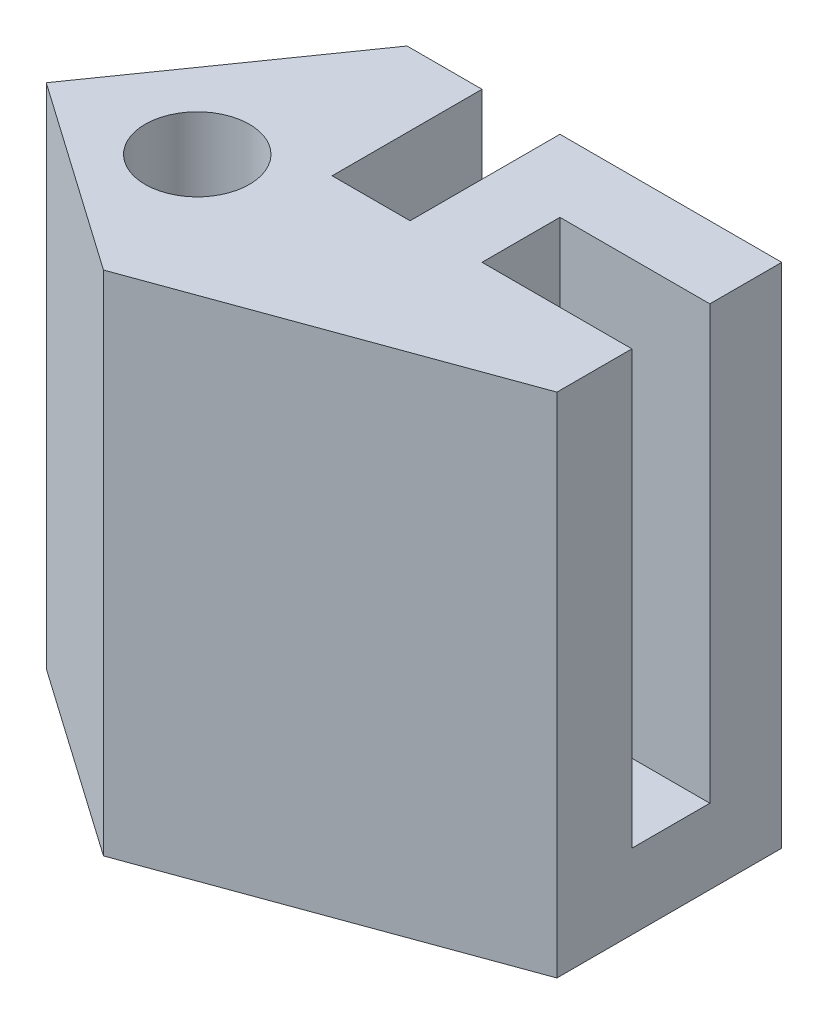
ISO-10303-21;
HEADER;
FILE_DESCRIPTION(('STEP AP214'),'2;1');
FILE_NAME('part.step','',(''),(''),'','','');
FILE_SCHEMA(('AUTOMOTIVE_DESIGN { 1 0 10303 214 1 1 1 1 }'));
ENDSEC;
DATA;
#1=APPLICATION_CONTEXT('core data for automotive mechanical design processes');
#2=APPLICATION_PROTOCOL_DEFINITION('international standard','automotive_design',2000,#1);
#3=PRODUCT_CONTEXT('',#1,'mechanical');
#4=PRODUCT('Part','Part','',(#3));
#5=PRODUCT_RELATED_PRODUCT_CATEGORY('part','',(#4));
#6=PRODUCT_DEFINITION_FORMATION('','',#4);
#7=PRODUCT_DEFINITION_CONTEXT('part definition',#1,'design');
#8=PRODUCT_DEFINITION('design','',#6,#7);
#9=PRODUCT_DEFINITION_SHAPE('','',#8);
#10=(LENGTH_UNIT() NAMED_UNIT(*) SI_UNIT(.MILLI.,.METRE.));
#11=(NAMED_UNIT(*) PLANE_ANGLE_UNIT() SI_UNIT($,.RADIAN.));
#12=(NAMED_UNIT(*) SI_UNIT($,.STERADIAN.) SOLID_ANGLE_UNIT());
#13=UNCERTAINTY_MEASURE_WITH_UNIT(LENGTH_MEASURE(1.E-05),#10,'distance_accuracy_value','');
#14=(GEOMETRIC_REPRESENTATION_CONTEXT(3) GLOBAL_UNCERTAINTY_ASSIGNED_CONTEXT((#13)) GLOBAL_UNIT_ASSIGNED_CONTEXT((#10,
#11,#12)) REPRESENTATION_CONTEXT('',''));
#15=CARTESIAN_POINT('',(0.,0.,0.));
#16=DIRECTION('',(0.,0.,1.));
#17=DIRECTION('',(1.,0.,0.));
#18=AXIS2_PLACEMENT_3D('',#15,#16,#17);
#19=CARTESIAN_POINT('',(12.954,36.650000106,-19.05));
#20=DIRECTION('',(1.,0.,0.));
#21=DIRECTION('',(0.,0.,-1.));
#22=AXIS2_PLACEMENT_3D('',#19,#20,#21);
#23=PLANE('',#22);
#24=DIRECTION('',(0.,0.,1.));
#25=VECTOR('',#24,1.);
#26=CARTESIAN_POINT('',(12.954,0.,-19.05));
#27=LINE('',#26,#25);
#28=CARTESIAN_POINT('',(12.954,0.,-19.05));
#29=VERTEX_POINT('',#28);
#30=CARTESIAN_POINT('',(12.954,0.,-6.35000000000003));
#31=VERTEX_POINT('',#30);
#32=EDGE_CURVE('E167',#29,#31,#27,.T.);
#33=ORIENTED_EDGE('',*,*,#32,.T.);
#34=DIRECTION('',(0.,-1.,0.));
#35=VECTOR('',#34,1.);
#36=CARTESIAN_POINT('',(12.954,36.650000106,-6.35000000000003));
#37=LINE('',#36,#35);
#38=CARTESIAN_POINT('',(12.954,36.650000106,-6.35000000000003));
#39=VERTEX_POINT('',#38);
#40=EDGE_CURVE('E235',#39,#31,#37,.T.);
#41=ORIENTED_EDGE('',*,*,#40,.F.);
#42=DIRECTION('',(0.,0.,1.));
#43=VECTOR('',#42,1.);
#44=CARTESIAN_POINT('',(12.954,36.650000106,-19.05));
#45=LINE('',#44,#43);
#46=CARTESIAN_POINT('',(12.954,36.650000106,-19.05));
#47=VERTEX_POINT('',#46);
#48=EDGE_CURVE('E174',#47,#39,#45,.T.);
#49=ORIENTED_EDGE('',*,*,#48,.F.);
#50=DIRECTION('',(0.,-1.,0.));
#51=VECTOR('',#50,1.);
#52=CARTESIAN_POINT('',(12.954,36.650000106,-19.05));
#53=LINE('',#52,#51);
#54=EDGE_CURVE('E47',#47,#29,#53,.T.);
#55=ORIENTED_EDGE('',*,*,#54,.T.);
#56=EDGE_LOOP('',(#33,#41,#49,#55));
#57=FACE_BOUND('',#56,.T.);
#58=ADVANCED_FACE('F39',(#57),#23,.F.);
#59=CARTESIAN_POINT('',(6.35000000000001,36.650000106,-6.35000000000003));
#60=DIRECTION('',(0.,0.,1.));
#61=DIRECTION('',(1.,0.,0.));
#62=AXIS2_PLACEMENT_3D('',#59,#60,#61);
#63=PLANE('',#62);
#64=DIRECTION('',(-1.,0.,0.));
#65=VECTOR('',#64,1.);
#66=CARTESIAN_POINT('',(6.35000000000001,0.,-6.35000000000003));
#67=LINE('',#66,#65);
#68=CARTESIAN_POINT('',(6.35000000000001,0.,-6.35000000000003));
#69=VERTEX_POINT('',#68);
#70=EDGE_CURVE('E198',#31,#69,#67,.T.);
#71=ORIENTED_EDGE('',*,*,#70,.T.);
#72=DIRECTION('',(0.,-1.,0.));
#73=VECTOR('',#72,1.);
#74=CARTESIAN_POINT('',(6.35000000000001,36.650000106,-6.35000000000003));
#75=LINE('',#74,#73);
#76=CARTESIAN_POINT('',(6.35000000000001,36.650000106,-6.35000000000003));
#77=VERTEX_POINT('',#76);
#78=EDGE_CURVE('E232',#77,#69,#75,.T.);
#79=ORIENTED_EDGE('',*,*,#78,.F.);
#80=DIRECTION('',(-1.,0.,0.));
#81=VECTOR('',#80,1.);
#82=CARTESIAN_POINT('',(6.35000000000001,36.650000106,-6.35000000000003));
#83=LINE('',#82,#81);
#84=EDGE_CURVE('E176',#39,#77,#83,.T.);
#85=ORIENTED_EDGE('',*,*,#84,.F.);
#86=ORIENTED_EDGE('',*,*,#40,.T.);
#87=EDGE_LOOP('',(#71,#79,#85,#86));
#88=FACE_BOUND('',#87,.T.);
#89=ADVANCED_FACE('F252',(#88),#63,.F.);
#90=CARTESIAN_POINT('',(6.35000000000001,36.650000106,-19.05));
#91=DIRECTION('',(-1.,0.,0.));
#92=DIRECTION('',(0.,0.,1.));
#93=AXIS2_PLACEMENT_3D('',#90,#91,#92);
#94=PLANE('',#93);
#95=DIRECTION('',(0.,0.,-1.));
#96=VECTOR('',#95,1.);
#97=CARTESIAN_POINT('',(6.35000000000001,0.,-19.05));
#98=LINE('',#97,#96);
#99=CARTESIAN_POINT('',(6.35000000000001,0.,-19.05));
#100=VERTEX_POINT('',#99);
#101=EDGE_CURVE('E201',#69,#100,#98,.T.);
#102=ORIENTED_EDGE('',*,*,#101,.T.);
#103=DIRECTION('',(0.,-1.,0.));
#104=VECTOR('',#103,1.);
#105=CARTESIAN_POINT('',(6.35000000000001,36.650000106,-19.05));
#106=LINE('',#105,#104);
#107=CARTESIAN_POINT('',(6.35000000000001,36.650000106,-19.05));
#108=VERTEX_POINT('',#107);
#109=EDGE_CURVE('E230',#108,#100,#106,.T.);
#110=ORIENTED_EDGE('',*,*,#109,.F.);
#111=DIRECTION('',(0.,0.,-1.));
#112=VECTOR('',#111,1.);
#113=CARTESIAN_POINT('',(6.35000000000001,36.650000106,-19.05));
#114=LINE('',#113,#112);
#115=EDGE_CURVE('E178',#77,#108,#114,.T.);
#116=ORIENTED_EDGE('',*,*,#115,.F.);
#117=ORIENTED_EDGE('',*,*,#78,.T.);
#118=EDGE_LOOP('',(#102,#110,#116,#117));
#119=FACE_BOUND('',#118,.T.);
#120=ADVANCED_FACE('F247',(#119),#94,.F.);
#121=CARTESIAN_POINT('',(0.,36.650000106,-19.05));
#122=DIRECTION('',(0.,0.,1.));
#123=DIRECTION('',(1.,0.,0.));
#124=AXIS2_PLACEMENT_3D('',#121,#122,#123);
#125=PLANE('',#124);
#126=ORIENTED_EDGE('',*,*,#109,.T.);
#127=DIRECTION('',(1.,0.,0.));
#128=VECTOR('',#127,1.);
#129=CARTESIAN_POINT('',(6.35000000000001,0.,-19.05));
#130=LINE('',#129,#128);
#131=EDGE_CURVE('E154',#100,#29,#130,.T.);
#132=ORIENTED_EDGE('',*,*,#131,.T.);
#133=ORIENTED_EDGE('',*,*,#54,.F.);
#134=DIRECTION('',(-1.,0.,0.));
#135=VECTOR('',#134,1.);
#136=CARTESIAN_POINT('',(12.954,36.650000106,-19.05));
#137=LINE('',#136,#135);
#138=CARTESIAN_POINT('',(31.75,36.650000106,-19.05));
#139=VERTEX_POINT('',#138);
#140=EDGE_CURVE('E136',#139,#47,#137,.T.);
#141=ORIENTED_EDGE('',*,*,#140,.F.);
#142=DIRECTION('',(0.,-1.,0.));
#143=VECTOR('',#142,1.);
#144=CARTESIAN_POINT('',(31.75,36.650000106,-19.05));
#145=LINE('',#144,#143);
#146=CARTESIAN_POINT('',(31.75,-6.35,-19.05));
#147=VERTEX_POINT('',#146);
#148=EDGE_CURVE('E11',#139,#147,#145,.T.);
#149=ORIENTED_EDGE('',*,*,#148,.T.);
#150=DIRECTION('',(1.,0.,0.));
#151=VECTOR('',#150,1.);
#152=CARTESIAN_POINT('',(12.954,-6.35,-19.05));
#153=LINE('',#152,#151);
#154=CARTESIAN_POINT('',(0.,-6.35,-19.05));
#155=VERTEX_POINT('',#154);
#156=EDGE_CURVE('E133',#155,#147,#153,.T.);
#157=ORIENTED_EDGE('',*,*,#156,.F.);
#158=DIRECTION('',(0.,-1.,0.));
#159=VECTOR('',#158,1.);
#160=CARTESIAN_POINT('',(0.,36.650000106,-19.05));
#161=LINE('',#160,#159);
#162=CARTESIAN_POINT('',(0.,36.650000106,-19.05));
#163=VERTEX_POINT('',#162);
#164=EDGE_CURVE('E228',#163,#155,#161,.T.);
#165=ORIENTED_EDGE('',*,*,#164,.F.);
#166=DIRECTION('',(-1.,0.,0.));
#167=VECTOR('',#166,1.);
#168=CARTESIAN_POINT('',(0.,36.650000106,-19.05));
#169=LINE('',#168,#167);
#170=EDGE_CURVE('E180',#108,#163,#169,.T.);
#171=ORIENTED_EDGE('',*,*,#170,.F.);
#172=EDGE_LOOP('',(#126,#132,#133,#141,#149,#157,#165,#171));
#173=FACE_BOUND('',#172,.T.);
#174=ADVANCED_FACE('F130',(#173),#125,.F.);
#175=CARTESIAN_POINT('',(0.,36.650000106,-19.05));
#176=DIRECTION('',(0.819152044288995,0.,0.573576436351041));
#177=DIRECTION('',(0.573576436351041,0.,-0.819152044288995));
#178=AXIS2_PLACEMENT_3D('',#175,#176,#177);
#179=PLANE('',#178);
#180=ORIENTED_EDGE('',*,*,#164,.T.);
#181=DIRECTION('',(0.573576436351041,0.,-0.819152044288995));
#182=VECTOR('',#181,1.);
#183=CARTESIAN_POINT('',(-12.5927825838149,-6.35,-1.06564265358779));
#184=LINE('',#183,#182);
#185=CARTESIAN_POINT('',(-12.5927825838149,-6.35,-1.06564265358779));
#186=VERTEX_POINT('',#185);
#187=EDGE_CURVE('E153',#186,#155,#184,.T.);
#188=ORIENTED_EDGE('',*,*,#187,.F.);
#189=DIRECTION('',(0.,-1.,0.));
#190=VECTOR('',#189,1.);
#191=CARTESIAN_POINT('',(-12.5927825838149,36.650000106,-1.06564265358779));
#192=LINE('',#191,#190);
#193=CARTESIAN_POINT('',(-12.5927825838149,36.650000106,-1.06564265358779));
#194=VERTEX_POINT('',#193);
#195=EDGE_CURVE('E226',#194,#186,#192,.T.);
#196=ORIENTED_EDGE('',*,*,#195,.F.);
#197=DIRECTION('',(-0.573576436351041,0.,0.819152044288995));
#198=VECTOR('',#197,1.);
#199=CARTESIAN_POINT('',(0.,36.650000106,-19.05));
#200=LINE('',#199,#198);
#201=EDGE_CURVE('E182',#163,#194,#200,.T.);
#202=ORIENTED_EDGE('',*,*,#201,.F.);
#203=EDGE_LOOP('',(#180,#188,#196,#202));
#204=FACE_BOUND('',#203,.T.);
#205=ADVANCED_FACE('F278',(#204),#179,.F.);
#206=CARTESIAN_POINT('',(-12.5927825838149,36.650000106,-1.06564265358779));
#207=DIRECTION('',(0.573576436351041,0.,-0.819152044288995));
#208=DIRECTION('',(-0.819152044288995,0.,-0.573576436351041));
#209=AXIS2_PLACEMENT_3D('',#206,#207,#208);
#210=PLANE('',#209);
#211=ORIENTED_EDGE('',*,*,#195,.T.);
#212=DIRECTION('',(-0.819152044288995,0.,-0.573576436351041));
#213=VECTOR('',#212,1.);
#214=CARTESIAN_POINT('',(3.57471880893178,-6.35,10.2549636956292));
#215=LINE('',#214,#213);
#216=CARTESIAN_POINT('',(3.57471880893178,-6.35,10.2549636956292));
#217=VERTEX_POINT('',#216);
#218=EDGE_CURVE('E164',#217,#186,#215,.T.);
#219=ORIENTED_EDGE('',*,*,#218,.F.);
#220=DIRECTION('',(0.,-1.,0.));
#221=VECTOR('',#220,1.);
#222=CARTESIAN_POINT('',(3.57471880893178,36.650000106,10.2549636956292));
#223=LINE('',#222,#221);
#224=CARTESIAN_POINT('',(3.57471880893178,36.650000106,10.2549636956292));
#225=VERTEX_POINT('',#224);
#226=EDGE_CURVE('E224',#225,#217,#223,.T.);
#227=ORIENTED_EDGE('',*,*,#226,.F.);
#228=DIRECTION('',(0.819152044288995,0.,0.573576436351041));
#229=VECTOR('',#228,1.);
#230=CARTESIAN_POINT('',(-12.5927825838149,36.650000106,-1.06564265358779));
#231=LINE('',#230,#229);
#232=EDGE_CURVE('E184',#194,#225,#231,.T.);
#233=ORIENTED_EDGE('',*,*,#232,.F.);
#234=EDGE_LOOP('',(#211,#219,#227,#233));
#235=FACE_BOUND('',#234,.T.);
#236=ADVANCED_FACE('F274',(#235),#210,.F.);
#237=CARTESIAN_POINT('',(3.57471880893178,36.650000106,10.2549636956292));
#238=DIRECTION('',(-0.342020143325669,0.,-0.939692620785908));
#239=DIRECTION('',(-0.939692620785908,0.,0.342020143325669));
#240=AXIS2_PLACEMENT_3D('',#237,#238,#239);
#241=PLANE('',#240);
#242=ORIENTED_EDGE('',*,*,#226,.T.);
#243=DIRECTION('',(-0.939692620785908,0.,0.342020143325669));
#244=VECTOR('',#243,1.);
#245=CARTESIAN_POINT('',(31.75,-6.35,0.));
#246=LINE('',#245,#244);
#247=CARTESIAN_POINT('',(31.75,-6.35,0.));
#248=VERTEX_POINT('',#247);
#249=EDGE_CURVE('E148',#248,#217,#246,.T.);
#250=ORIENTED_EDGE('',*,*,#249,.F.);
#251=DIRECTION('',(0.,-1.,0.));
#252=VECTOR('',#251,1.);
#253=CARTESIAN_POINT('',(31.75,36.650000106,0.));
#254=LINE('',#253,#252);
#255=CARTESIAN_POINT('',(31.75,36.650000106,0.));
#256=VERTEX_POINT('',#255);
#257=EDGE_CURVE('E144',#256,#248,#254,.T.);
#258=ORIENTED_EDGE('',*,*,#257,.F.);
#259=DIRECTION('',(0.939692620785908,0.,-0.342020143325669));
#260=VECTOR('',#259,1.);
#261=CARTESIAN_POINT('',(3.57471880893178,36.650000106,10.2549636956292));
#262=LINE('',#261,#260);
#263=EDGE_CURVE('E186',#225,#256,#262,.T.);
#264=ORIENTED_EDGE('',*,*,#263,.F.);
#265=EDGE_LOOP('',(#242,#250,#258,#264));
#266=FACE_BOUND('',#265,.T.);
#267=ADVANCED_FACE('F271',(#266),#241,.F.);
#268=CARTESIAN_POINT('',(31.75,36.650000106,0.));
#269=DIRECTION('',(-1.,0.,0.));
#270=DIRECTION('',(0.,0.,1.));
#271=AXIS2_PLACEMENT_3D('',#268,#269,#270);
#272=PLANE('',#271);
#273=ORIENTED_EDGE('',*,*,#257,.T.);
#274=DIRECTION('',(0.,0.,1.));
#275=VECTOR('',#274,1.);
#276=CARTESIAN_POINT('',(31.75,-6.35,-19.05));
#277=LINE('',#276,#275);
#278=EDGE_CURVE('E140',#147,#248,#277,.T.);
#279=ORIENTED_EDGE('',*,*,#278,.F.);
#280=ORIENTED_EDGE('',*,*,#148,.F.);
#281=DIRECTION('',(0.,0.,-1.));
#282=VECTOR('',#281,1.);
#283=CARTESIAN_POINT('',(31.75,36.650000106,-12.954));
#284=LINE('',#283,#282);
#285=CARTESIAN_POINT('',(31.75,36.650000106,-12.954));
#286=VERTEX_POINT('',#285);
#287=EDGE_CURVE('E170',#286,#139,#284,.T.);
#288=ORIENTED_EDGE('',*,*,#287,.F.);
#289=DIRECTION('',(0.,-1.,0.));
#290=VECTOR('',#289,1.);
#291=CARTESIAN_POINT('',(31.75,36.650000106,-12.954));
#292=LINE('',#291,#290);
#293=CARTESIAN_POINT('',(31.75,0.,-12.954));
#294=VERTEX_POINT('',#293);
#295=EDGE_CURVE('E195',#286,#294,#292,.T.);
#296=ORIENTED_EDGE('',*,*,#295,.T.);
#297=DIRECTION('',(0.,0.,1.));
#298=VECTOR('',#297,1.);
#299=CARTESIAN_POINT('',(31.75,0.,-6.35));
#300=LINE('',#299,#298);
#301=CARTESIAN_POINT('',(31.75,0.,-6.35));
#302=VERTEX_POINT('',#301);
#303=EDGE_CURVE('E157',#294,#302,#300,.T.);
#304=ORIENTED_EDGE('',*,*,#303,.T.);
#305=DIRECTION('',(0.,-1.,0.));
#306=VECTOR('',#305,1.);
#307=CARTESIAN_POINT('',(31.75,36.650000106,-6.35));
#308=LINE('',#307,#306);
#309=CARTESIAN_POINT('',(31.75,36.650000106,-6.35));
#310=VERTEX_POINT('',#309);
#311=EDGE_CURVE('E220',#310,#302,#308,.T.);
#312=ORIENTED_EDGE('',*,*,#311,.F.);
#313=DIRECTION('',(0.,0.,-1.));
#314=VECTOR('',#313,1.);
#315=CARTESIAN_POINT('',(31.75,36.650000106,0.));
#316=LINE('',#315,#314);
#317=EDGE_CURVE('E188',#256,#310,#316,.T.);
#318=ORIENTED_EDGE('',*,*,#317,.F.);
#319=EDGE_LOOP('',(#273,#279,#280,#288,#296,#304,#312,#318));
#320=FACE_BOUND('',#319,.T.);
#321=ADVANCED_FACE('F141',(#320),#272,.F.);
#322=CARTESIAN_POINT('',(31.75,36.650000106,-6.35));
#323=DIRECTION('',(0.,0.,1.));
#324=DIRECTION('',(1.,0.,0.));
#325=AXIS2_PLACEMENT_3D('',#322,#323,#324);
#326=PLANE('',#325);
#327=DIRECTION('',(-1.,0.,0.));
#328=VECTOR('',#327,1.);
#329=CARTESIAN_POINT('',(31.75,0.,-6.35));
#330=LINE('',#329,#328);
#331=CARTESIAN_POINT('',(19.05,0.,-6.35));
#332=VERTEX_POINT('',#331);
#333=EDGE_CURVE('E204',#302,#332,#330,.T.);
#334=ORIENTED_EDGE('',*,*,#333,.T.);
#335=DIRECTION('',(0.,-1.,0.));
#336=VECTOR('',#335,1.);
#337=CARTESIAN_POINT('',(19.05,36.650000106,-6.35));
#338=LINE('',#337,#336);
#339=CARTESIAN_POINT('',(19.05,36.650000106,-6.35));
#340=VERTEX_POINT('',#339);
#341=EDGE_CURVE('E217',#340,#332,#338,.T.);
#342=ORIENTED_EDGE('',*,*,#341,.F.);
#343=DIRECTION('',(-1.,0.,0.));
#344=VECTOR('',#343,1.);
#345=CARTESIAN_POINT('',(31.75,36.650000106,-6.35));
#346=LINE('',#345,#344);
#347=EDGE_CURVE('E190',#310,#340,#346,.T.);
#348=ORIENTED_EDGE('',*,*,#347,.F.);
#349=ORIENTED_EDGE('',*,*,#311,.T.);
#350=EDGE_LOOP('',(#334,#342,#348,#349));
#351=FACE_BOUND('',#350,.T.);
#352=ADVANCED_FACE('F266',(#351),#326,.F.);
#353=CARTESIAN_POINT('',(19.05,36.650000106,-6.35));
#354=DIRECTION('',(-1.,0.,0.));
#355=DIRECTION('',(0.,0.,1.));
#356=AXIS2_PLACEMENT_3D('',#353,#354,#355);
#357=PLANE('',#356);
#358=DIRECTION('',(0.,0.,-1.));
#359=VECTOR('',#358,1.);
#360=CARTESIAN_POINT('',(19.05,0.,-6.35));
#361=LINE('',#360,#359);
#362=CARTESIAN_POINT('',(19.05,0.,-12.954));
#363=VERTEX_POINT('',#362);
#364=EDGE_CURVE('E207',#332,#363,#361,.T.);
#365=ORIENTED_EDGE('',*,*,#364,.T.);
#366=DIRECTION('',(0.,-1.,0.));
#367=VECTOR('',#366,1.);
#368=CARTESIAN_POINT('',(19.05,36.650000106,-12.954));
#369=LINE('',#368,#367);
#370=CARTESIAN_POINT('',(19.05,36.650000106,-12.954));
#371=VERTEX_POINT('',#370);
#372=EDGE_CURVE('E214',#371,#363,#369,.T.);
#373=ORIENTED_EDGE('',*,*,#372,.F.);
#374=DIRECTION('',(0.,0.,-1.));
#375=VECTOR('',#374,1.);
#376=CARTESIAN_POINT('',(19.05,36.650000106,-6.35));
#377=LINE('',#376,#375);
#378=EDGE_CURVE('E192',#340,#371,#377,.T.);
#379=ORIENTED_EDGE('',*,*,#378,.F.);
#380=ORIENTED_EDGE('',*,*,#341,.T.);
#381=EDGE_LOOP('',(#365,#373,#379,#380));
#382=FACE_BOUND('',#381,.T.);
#383=ADVANCED_FACE('F261',(#382),#357,.F.);
#384=CARTESIAN_POINT('',(31.75,36.650000106,-12.954));
#385=DIRECTION('',(0.,0.,-1.));
#386=DIRECTION('',(-1.,0.,0.));
#387=AXIS2_PLACEMENT_3D('',#384,#385,#386);
#388=PLANE('',#387);
#389=DIRECTION('',(1.,0.,0.));
#390=VECTOR('',#389,1.);
#391=CARTESIAN_POINT('',(31.75,0.,-12.954));
#392=LINE('',#391,#390);
#393=EDGE_CURVE('E172',#363,#294,#392,.T.);
#394=ORIENTED_EDGE('',*,*,#393,.T.);
#395=ORIENTED_EDGE('',*,*,#295,.F.);
#396=DIRECTION('',(1.,0.,0.));
#397=VECTOR('',#396,1.);
#398=CARTESIAN_POINT('',(31.75,36.650000106,-12.954));
#399=LINE('',#398,#397);
#400=EDGE_CURVE('E54',#371,#286,#399,.T.);
#401=ORIENTED_EDGE('',*,*,#400,.F.);
#402=ORIENTED_EDGE('',*,*,#372,.T.);
#403=EDGE_LOOP('',(#394,#395,#401,#402));
#404=FACE_BOUND('',#403,.T.);
#405=ADVANCED_FACE('F256',(#404),#388,.F.);
#406=CARTESIAN_POINT('',(0.,36.650000106,0.));
#407=DIRECTION('',(0.,-1.,0.));
#408=DIRECTION('',(0.,0.,-1.));
#409=AXIS2_PLACEMENT_3D('',#406,#407,#408);
#410=PLANE('',#409);
#411=CARTESIAN_POINT('',(-0.939868465090762,36.650000106,-2.20848671190918));
#412=DIRECTION('',(0.,1.,0.));
#413=DIRECTION('',(0.,0.,1.));
#414=AXIS2_PLACEMENT_3D('',#411,#412,#413);
#415=CIRCLE('',#414,4.41959999999999);
#416=CARTESIAN_POINT('',(-0.939868465090762,36.650000106,2.21111328809082));
#417=VERTEX_POINT('',#416);
#418=EDGE_CURVE('E445',#417,#417,#415,.T.);
#419=ORIENTED_EDGE('',*,*,#418,.F.);
#420=EDGE_LOOP('',(#419));
#421=FACE_BOUND('',#420,.T.);
#422=ORIENTED_EDGE('',*,*,#287,.T.);
#423=ORIENTED_EDGE('',*,*,#140,.T.);
#424=ORIENTED_EDGE('',*,*,#48,.T.);
#425=ORIENTED_EDGE('',*,*,#84,.T.);
#426=ORIENTED_EDGE('',*,*,#115,.T.);
#427=ORIENTED_EDGE('',*,*,#170,.T.);
#428=ORIENTED_EDGE('',*,*,#201,.T.);
#429=ORIENTED_EDGE('',*,*,#232,.T.);
#430=ORIENTED_EDGE('',*,*,#263,.T.);
#431=ORIENTED_EDGE('',*,*,#317,.T.);
#432=ORIENTED_EDGE('',*,*,#347,.T.);
#433=ORIENTED_EDGE('',*,*,#378,.T.);
#434=ORIENTED_EDGE('',*,*,#400,.T.);
#435=EDGE_LOOP('',(#422,#423,#424,#425,#426,#427,#428,#429,#430,#431,#432,#433,#434));
#436=FACE_BOUND('',#435,.T.);
#437=ADVANCED_FACE('F253',(#421,#436),#410,.F.);
#438=CARTESIAN_POINT('',(0.,0.,0.));
#439=DIRECTION('',(0.,-1.,0.));
#440=DIRECTION('',(0.,0.,-1.));
#441=AXIS2_PLACEMENT_3D('',#438,#439,#440);
#442=PLANE('',#441);
#443=ORIENTED_EDGE('',*,*,#393,.F.);
#444=ORIENTED_EDGE('',*,*,#364,.F.);
#445=ORIENTED_EDGE('',*,*,#333,.F.);
#446=ORIENTED_EDGE('',*,*,#303,.F.);
#447=EDGE_LOOP('',(#443,#444,#445,#446));
#448=FACE_BOUND('',#447,.T.);
#449=ADVANCED_FACE('F259',(#448),#442,.F.);
#450=CARTESIAN_POINT('',(0.,-6.35,0.));
#451=DIRECTION('',(0.,-1.,0.));
#452=DIRECTION('',(0.,0.,-1.));
#453=AXIS2_PLACEMENT_3D('',#450,#451,#452);
#454=PLANE('',#453);
#455=CARTESIAN_POINT('',(-0.939868465090762,-6.35,-2.20848671190918));
#456=DIRECTION('',(0.,1.,0.));
#457=DIRECTION('',(0.,0.,1.));
#458=AXIS2_PLACEMENT_3D('',#455,#456,#457);
#459=CIRCLE('',#458,4.41959999999999);
#460=CARTESIAN_POINT('',(-0.939868465090762,-6.35,2.21111328809081));
#461=VERTEX_POINT('',#460);
#462=EDGE_CURVE('E160',#461,#461,#459,.T.);
#463=ORIENTED_EDGE('',*,*,#462,.T.);
#464=EDGE_LOOP('',(#463));
#465=FACE_BOUND('',#464,.T.);
#466=ORIENTED_EDGE('',*,*,#156,.T.);
#467=ORIENTED_EDGE('',*,*,#278,.T.);
#468=ORIENTED_EDGE('',*,*,#249,.T.);
#469=ORIENTED_EDGE('',*,*,#218,.T.);
#470=ORIENTED_EDGE('',*,*,#187,.T.);
#471=EDGE_LOOP('',(#466,#467,#468,#469,#470));
#472=FACE_BOUND('',#471,.T.);
#473=ADVANCED_FACE('F150',(#465,#472),#454,.T.);
#474=ORIENTED_EDGE('',*,*,#101,.F.);
#475=ORIENTED_EDGE('',*,*,#70,.F.);
#476=ORIENTED_EDGE('',*,*,#32,.F.);
#477=ORIENTED_EDGE('',*,*,#131,.F.);
#478=EDGE_LOOP('',(#474,#475,#476,#477));
#479=FACE_BOUND('',#478,.T.);
#480=ADVANCED_FACE('F244',(#479),#442,.F.);
#481=CARTESIAN_POINT('',(-0.939868465090762,36.650000106,-2.20848671190918));
#482=DIRECTION('',(0.,1.,0.));
#483=DIRECTION('',(0.,0.,1.));
#484=AXIS2_PLACEMENT_3D('',#481,#482,#483);
#485=CYLINDRICAL_SURFACE('',#484,4.41959999999999);
#486=ORIENTED_EDGE('',*,*,#462,.F.);
#487=EDGE_LOOP('',(#486));
#488=FACE_BOUND('',#487,.T.);
#489=ORIENTED_EDGE('',*,*,#418,.T.);
#490=EDGE_LOOP('',(#489));
#491=FACE_BOUND('',#490,.T.);
#492=ADVANCED_FACE('F378',(#488,#491),#485,.F.);
#493=CLOSED_SHELL('',(#58,#89,#120,#174,#205,#236,#267,#321,#352,#383,#405,#437,#449,#473,#480,#492));
#494=MANIFOLD_SOLID_BREP('B2',#493);
#495=ADVANCED_BREP_SHAPE_REPRESENTATION('',(#18,#494),#14);
#496=SHAPE_DEFINITION_REPRESENTATION(#9,#495);
ENDSEC;
END-ISO-10303-21;
